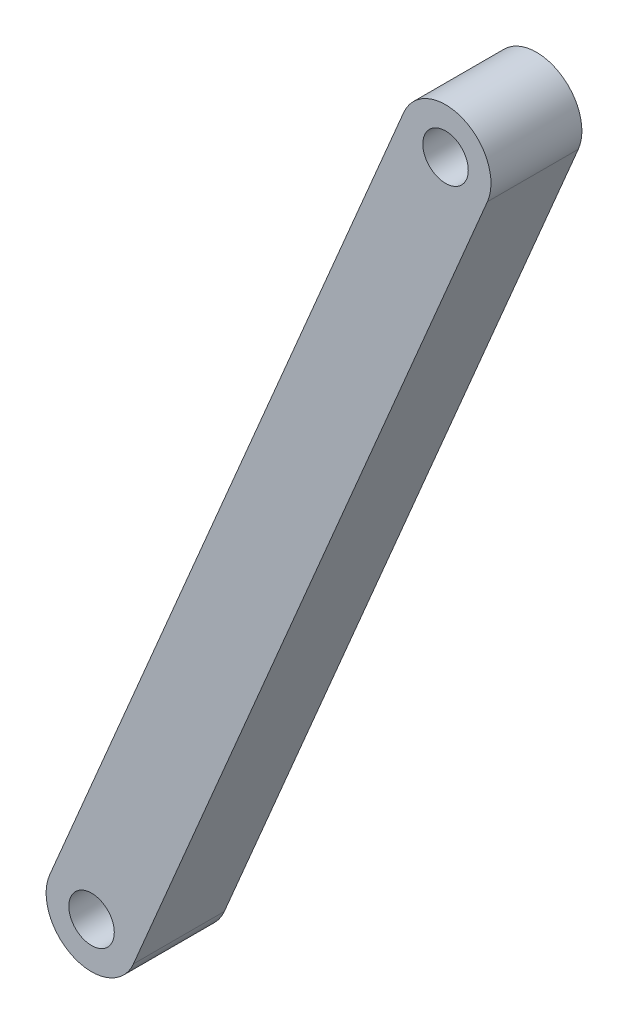
ISO-10303-21;
HEADER;
FILE_DESCRIPTION(('STEP AP214'),'2;1');
FILE_NAME('part.step','',(''),(''),'','','');
FILE_SCHEMA(('AUTOMOTIVE_DESIGN { 1 0 10303 214 1 1 1 1 }'));
ENDSEC;
DATA;
#1=APPLICATION_CONTEXT('core data for automotive mechanical design processes');
#2=APPLICATION_PROTOCOL_DEFINITION('international standard','automotive_design',2000,#1);
#3=PRODUCT_CONTEXT('',#1,'mechanical');
#4=PRODUCT('Part','Part','',(#3));
#5=PRODUCT_RELATED_PRODUCT_CATEGORY('part','',(#4));
#6=PRODUCT_DEFINITION_FORMATION('','',#4);
#7=PRODUCT_DEFINITION_CONTEXT('part definition',#1,'design');
#8=PRODUCT_DEFINITION('design','',#6,#7);
#9=PRODUCT_DEFINITION_SHAPE('','',#8);
#10=(LENGTH_UNIT() NAMED_UNIT(*) SI_UNIT(.MILLI.,.METRE.));
#11=(NAMED_UNIT(*) PLANE_ANGLE_UNIT() SI_UNIT($,.RADIAN.));
#12=(NAMED_UNIT(*) SI_UNIT($,.STERADIAN.) SOLID_ANGLE_UNIT());
#13=UNCERTAINTY_MEASURE_WITH_UNIT(LENGTH_MEASURE(1.E-05),#10,'distance_accuracy_value','');
#14=(GEOMETRIC_REPRESENTATION_CONTEXT(3) GLOBAL_UNCERTAINTY_ASSIGNED_CONTEXT((#13)) GLOBAL_UNIT_ASSIGNED_CONTEXT((#10,
#11,#12)) REPRESENTATION_CONTEXT('',''));
#15=CARTESIAN_POINT('',(0.,0.,0.));
#16=DIRECTION('',(0.,0.,1.));
#17=DIRECTION('',(1.,0.,0.));
#18=AXIS2_PLACEMENT_3D('',#15,#16,#17);
#19=CARTESIAN_POINT('',(39.0528610380754,25.,5.));
#20=DIRECTION('',(0.,0.,1.));
#21=DIRECTION('',(1.,0.,0.));
#22=AXIS2_PLACEMENT_3D('',#19,#20,#21);
#23=PLANE('',#22);
#24=CARTESIAN_POINT('',(78.000381166286,117.103695234571,5.));
#25=DIRECTION('',(0.,0.,1.));
#26=DIRECTION('',(1.,0.,0.));
#27=AXIS2_PLACEMENT_3D('',#24,#25,#26);
#28=CIRCLE('',#27,2.5);
#29=CARTESIAN_POINT('',(80.500381166286,117.103695234571,5.));
#30=VERTEX_POINT('',#29);
#31=EDGE_CURVE('E97',#30,#30,#28,.T.);
#32=ORIENTED_EDGE('',*,*,#31,.F.);
#33=EDGE_LOOP('',(#32));
#34=FACE_BOUND('',#33,.T.);
#35=CARTESIAN_POINT('',(39.0528610380754,25.,5.));
#36=DIRECTION('',(0.,0.,1.));
#37=DIRECTION('',(1.,0.,0.));
#38=AXIS2_PLACEMENT_3D('',#35,#36,#37);
#39=CIRCLE('',#38,4.99999999999999);
#40=CARTESIAN_POINT('',(34.4476762763469,26.9473760064105,5.));
#41=VERTEX_POINT('',#40);
#42=CARTESIAN_POINT('',(43.6580457998039,23.0526239935895,5.));
#43=VERTEX_POINT('',#42);
#44=EDGE_CURVE('E82',#41,#43,#39,.T.);
#45=ORIENTED_EDGE('',*,*,#44,.T.);
#46=DIRECTION('',(0.389475201282104,0.921036952345705,0.));
#47=VECTOR('',#46,1.);
#48=CARTESIAN_POINT('',(43.6580457998039,23.0526239935895,5.));
#49=LINE('',#48,#47);
#50=CARTESIAN_POINT('',(82.6055659280145,115.15631922816,5.));
#51=VERTEX_POINT('',#50);
#52=EDGE_CURVE('E77',#43,#51,#49,.T.);
#53=ORIENTED_EDGE('',*,*,#52,.T.);
#54=CARTESIAN_POINT('',(78.000381166286,117.103695234571,5.));
#55=DIRECTION('',(0.,0.,1.));
#56=DIRECTION('',(1.,0.,0.));
#57=AXIS2_PLACEMENT_3D('',#54,#55,#56);
#58=CIRCLE('',#57,5.);
#59=CARTESIAN_POINT('',(73.3951964045574,119.051071240981,5.));
#60=VERTEX_POINT('',#59);
#61=EDGE_CURVE('E80',#51,#60,#58,.T.);
#62=ORIENTED_EDGE('',*,*,#61,.T.);
#63=DIRECTION('',(-0.389475201282104,-0.921036952345705,0.));
#64=VECTOR('',#63,1.);
#65=CARTESIAN_POINT('',(34.4476762763469,26.9473760064105,5.));
#66=LINE('',#65,#64);
#67=EDGE_CURVE('E47',#60,#41,#66,.T.);
#68=ORIENTED_EDGE('',*,*,#67,.T.);
#69=EDGE_LOOP('',(#45,#53,#62,#68));
#70=FACE_BOUND('',#69,.T.);
#71=CARTESIAN_POINT('',(39.0528610380754,25.,5.));
#72=DIRECTION('',(0.,0.,1.));
#73=DIRECTION('',(1.,0.,0.));
#74=AXIS2_PLACEMENT_3D('',#71,#72,#73);
#75=CIRCLE('',#74,2.5);
#76=CARTESIAN_POINT('',(41.5528610380754,25.,5.));
#77=VERTEX_POINT('',#76);
#78=EDGE_CURVE('E112',#77,#77,#75,.T.);
#79=ORIENTED_EDGE('',*,*,#78,.F.);
#80=EDGE_LOOP('',(#79));
#81=FACE_BOUND('',#80,.T.);
#82=ADVANCED_FACE('F30',(#34,#70,#81),#23,.T.);
#83=CARTESIAN_POINT('',(39.0528610380754,25.,-5.));
#84=DIRECTION('',(0.,0.,1.));
#85=DIRECTION('',(1.,0.,0.));
#86=AXIS2_PLACEMENT_3D('',#83,#84,#85);
#87=PLANE('',#86);
#88=CARTESIAN_POINT('',(39.0528610380754,25.,-5.));
#89=DIRECTION('',(0.,0.,1.));
#90=DIRECTION('',(1.,0.,0.));
#91=AXIS2_PLACEMENT_3D('',#88,#89,#90);
#92=CIRCLE('',#91,4.99999999999999);
#93=CARTESIAN_POINT('',(34.4476762763469,26.9473760064105,-5.));
#94=VERTEX_POINT('',#93);
#95=CARTESIAN_POINT('',(43.6580457998039,23.0526239935895,-5.));
#96=VERTEX_POINT('',#95);
#97=EDGE_CURVE('E94',#94,#96,#92,.T.);
#98=ORIENTED_EDGE('',*,*,#97,.F.);
#99=DIRECTION('',(-0.389475201282104,-0.921036952345705,0.));
#100=VECTOR('',#99,1.);
#101=CARTESIAN_POINT('',(34.4476762763469,26.9473760064105,-5.));
#102=LINE('',#101,#100);
#103=CARTESIAN_POINT('',(73.3951964045574,119.051071240981,-5.));
#104=VERTEX_POINT('',#103);
#105=EDGE_CURVE('E70',#104,#94,#102,.T.);
#106=ORIENTED_EDGE('',*,*,#105,.F.);
#107=CARTESIAN_POINT('',(78.000381166286,117.103695234571,-5.));
#108=DIRECTION('',(0.,0.,1.));
#109=DIRECTION('',(1.,0.,0.));
#110=AXIS2_PLACEMENT_3D('',#107,#108,#109);
#111=CIRCLE('',#110,5.);
#112=CARTESIAN_POINT('',(82.6055659280145,115.15631922816,-5.));
#113=VERTEX_POINT('',#112);
#114=EDGE_CURVE('E64',#113,#104,#111,.T.);
#115=ORIENTED_EDGE('',*,*,#114,.F.);
#116=DIRECTION('',(0.389475201282104,0.921036952345705,0.));
#117=VECTOR('',#116,1.);
#118=CARTESIAN_POINT('',(43.6580457998039,23.0526239935895,-5.));
#119=LINE('',#118,#117);
#120=EDGE_CURVE('E86',#96,#113,#119,.T.);
#121=ORIENTED_EDGE('',*,*,#120,.F.);
#122=EDGE_LOOP('',(#98,#106,#115,#121));
#123=FACE_BOUND('',#122,.T.);
#124=CARTESIAN_POINT('',(78.000381166286,117.103695234571,-5.));
#125=DIRECTION('',(0.,0.,1.));
#126=DIRECTION('',(1.,0.,0.));
#127=AXIS2_PLACEMENT_3D('',#124,#125,#126);
#128=CIRCLE('',#127,2.5);
#129=CARTESIAN_POINT('',(80.500381166286,117.103695234571,-5.));
#130=VERTEX_POINT('',#129);
#131=EDGE_CURVE('E109',#130,#130,#128,.T.);
#132=ORIENTED_EDGE('',*,*,#131,.T.);
#133=EDGE_LOOP('',(#132));
#134=FACE_BOUND('',#133,.T.);
#135=CARTESIAN_POINT('',(39.0528610380754,25.,-5.));
#136=DIRECTION('',(0.,0.,1.));
#137=DIRECTION('',(1.,0.,0.));
#138=AXIS2_PLACEMENT_3D('',#135,#136,#137);
#139=CIRCLE('',#138,2.5);
#140=CARTESIAN_POINT('',(41.5528610380754,25.,-5.));
#141=VERTEX_POINT('',#140);
#142=EDGE_CURVE('E115',#141,#141,#139,.T.);
#143=ORIENTED_EDGE('',*,*,#142,.T.);
#144=EDGE_LOOP('',(#143));
#145=FACE_BOUND('',#144,.T.);
#146=ADVANCED_FACE('F105',(#123,#134,#145),#87,.F.);
#147=CARTESIAN_POINT('',(39.0528610380754,25.,5.));
#148=DIRECTION('',(0.,0.,-1.));
#149=DIRECTION('',(-1.,0.,0.));
#150=AXIS2_PLACEMENT_3D('',#147,#148,#149);
#151=CYLINDRICAL_SURFACE('',#150,4.99999999999999);
#152=ORIENTED_EDGE('',*,*,#97,.T.);
#153=DIRECTION('',(0.,0.,-1.));
#154=VECTOR('',#153,1.);
#155=CARTESIAN_POINT('',(43.6580457998039,23.0526239935895,5.));
#156=LINE('',#155,#154);
#157=EDGE_CURVE('E11',#43,#96,#156,.T.);
#158=ORIENTED_EDGE('',*,*,#157,.F.);
#159=ORIENTED_EDGE('',*,*,#44,.F.);
#160=DIRECTION('',(0.,0.,-1.));
#161=VECTOR('',#160,1.);
#162=CARTESIAN_POINT('',(34.4476762763469,26.9473760064105,5.));
#163=LINE('',#162,#161);
#164=EDGE_CURVE('E90',#41,#94,#163,.T.);
#165=ORIENTED_EDGE('',*,*,#164,.T.);
#166=EDGE_LOOP('',(#152,#158,#159,#165));
#167=FACE_BOUND('',#166,.T.);
#168=ADVANCED_FACE('F32',(#167),#151,.T.);
#169=CARTESIAN_POINT('',(43.6580457998039,23.0526239935895,5.));
#170=DIRECTION('',(-0.921036952345705,0.389475201282104,0.));
#171=DIRECTION('',(-0.389475201282104,-0.921036952345705,0.));
#172=AXIS2_PLACEMENT_3D('',#169,#170,#171);
#173=PLANE('',#172);
#174=ORIENTED_EDGE('',*,*,#120,.T.);
#175=DIRECTION('',(0.,0.,-1.));
#176=VECTOR('',#175,1.);
#177=CARTESIAN_POINT('',(82.6055659280145,115.15631922816,5.));
#178=LINE('',#177,#176);
#179=EDGE_CURVE('E39',#51,#113,#178,.T.);
#180=ORIENTED_EDGE('',*,*,#179,.F.);
#181=ORIENTED_EDGE('',*,*,#52,.F.);
#182=ORIENTED_EDGE('',*,*,#157,.T.);
#183=EDGE_LOOP('',(#174,#180,#181,#182));
#184=FACE_BOUND('',#183,.T.);
#185=ADVANCED_FACE('F85',(#184),#173,.F.);
#186=CARTESIAN_POINT('',(78.000381166286,117.103695234571,5.));
#187=DIRECTION('',(0.,0.,-1.));
#188=DIRECTION('',(-1.,0.,0.));
#189=AXIS2_PLACEMENT_3D('',#186,#187,#188);
#190=CYLINDRICAL_SURFACE('',#189,5.);
#191=ORIENTED_EDGE('',*,*,#114,.T.);
#192=DIRECTION('',(0.,0.,-1.));
#193=VECTOR('',#192,1.);
#194=CARTESIAN_POINT('',(73.3951964045574,119.051071240981,5.));
#195=LINE('',#194,#193);
#196=EDGE_CURVE('E87',#60,#104,#195,.T.);
#197=ORIENTED_EDGE('',*,*,#196,.F.);
#198=ORIENTED_EDGE('',*,*,#61,.F.);
#199=ORIENTED_EDGE('',*,*,#179,.T.);
#200=EDGE_LOOP('',(#191,#197,#198,#199));
#201=FACE_BOUND('',#200,.T.);
#202=ADVANCED_FACE('F88',(#201),#190,.T.);
#203=CARTESIAN_POINT('',(34.4476762763469,26.9473760064105,5.));
#204=DIRECTION('',(0.921036952345705,-0.389475201282104,0.));
#205=DIRECTION('',(0.389475201282104,0.921036952345705,0.));
#206=AXIS2_PLACEMENT_3D('',#203,#204,#205);
#207=PLANE('',#206);
#208=ORIENTED_EDGE('',*,*,#105,.T.);
#209=ORIENTED_EDGE('',*,*,#164,.F.);
#210=ORIENTED_EDGE('',*,*,#67,.F.);
#211=ORIENTED_EDGE('',*,*,#196,.T.);
#212=EDGE_LOOP('',(#208,#209,#210,#211));
#213=FACE_BOUND('',#212,.T.);
#214=ADVANCED_FACE('F102',(#213),#207,.F.);
#215=CARTESIAN_POINT('',(78.000381166286,117.103695234571,5.));
#216=DIRECTION('',(0.,0.,-1.));
#217=DIRECTION('',(-1.,0.,0.));
#218=AXIS2_PLACEMENT_3D('',#215,#216,#217);
#219=CYLINDRICAL_SURFACE('',#218,2.5);
#220=ORIENTED_EDGE('',*,*,#31,.T.);
#221=EDGE_LOOP('',(#220));
#222=FACE_BOUND('',#221,.T.);
#223=ORIENTED_EDGE('',*,*,#131,.F.);
#224=EDGE_LOOP('',(#223));
#225=FACE_BOUND('',#224,.T.);
#226=ADVANCED_FACE('F132',(#222,#225),#219,.F.);
#227=CARTESIAN_POINT('',(39.0528610380754,25.,5.));
#228=DIRECTION('',(0.,0.,-1.));
#229=DIRECTION('',(-1.,0.,0.));
#230=AXIS2_PLACEMENT_3D('',#227,#228,#229);
#231=CYLINDRICAL_SURFACE('',#230,2.5);
#232=ORIENTED_EDGE('',*,*,#78,.T.);
#233=EDGE_LOOP('',(#232));
#234=FACE_BOUND('',#233,.T.);
#235=ORIENTED_EDGE('',*,*,#142,.F.);
#236=EDGE_LOOP('',(#235));
#237=FACE_BOUND('',#236,.T.);
#238=ADVANCED_FACE('F121',(#234,#237),#231,.F.);
#239=CLOSED_SHELL('',(#82,#146,#168,#185,#202,#214,#226,#238));
#240=MANIFOLD_SOLID_BREP('B2',#239);
#241=ADVANCED_BREP_SHAPE_REPRESENTATION('',(#18,#240),#14);
#242=SHAPE_DEFINITION_REPRESENTATION(#9,#241);
ENDSEC;
END-ISO-10303-21;
